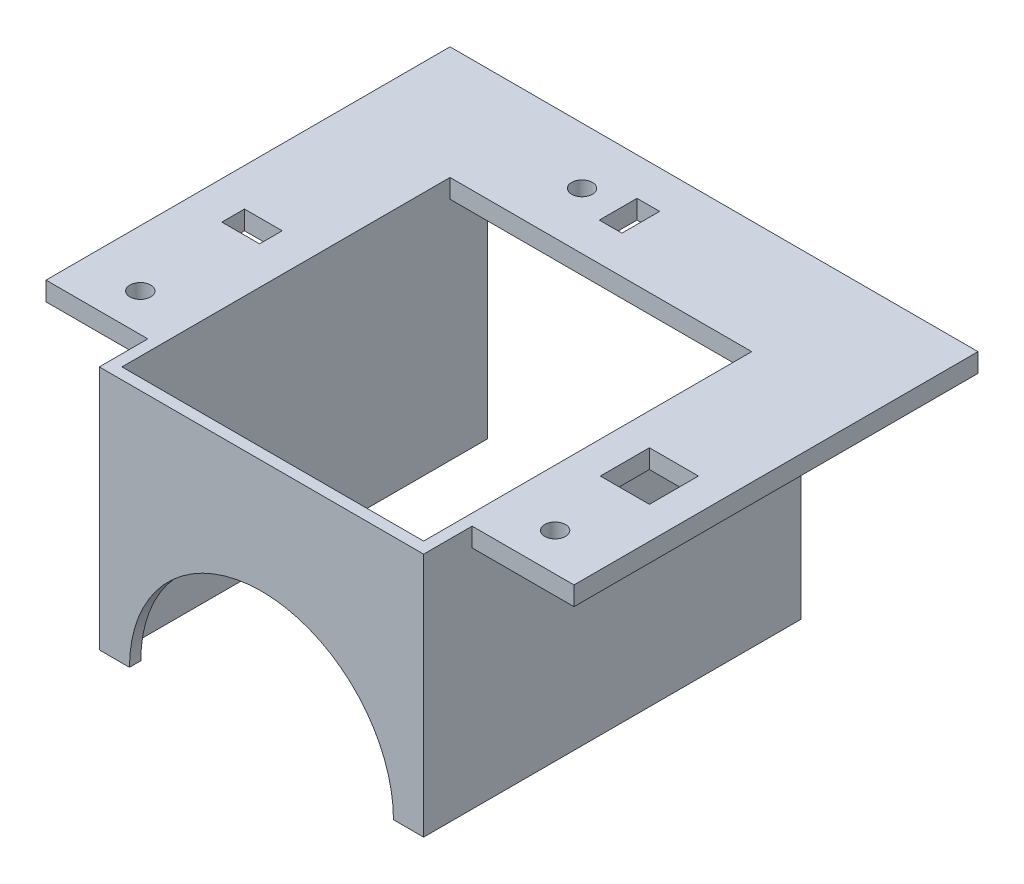
ISO-10303-21;
HEADER;
FILE_DESCRIPTION(('STEP AP214'),'2;1');
FILE_NAME('part.step','',(''),(''),'','','');
FILE_SCHEMA(('AUTOMOTIVE_DESIGN { 1 0 10303 214 1 1 1 1 }'));
ENDSEC;
DATA;
#1=APPLICATION_CONTEXT('core data for automotive mechanical design processes');
#2=APPLICATION_PROTOCOL_DEFINITION('international standard','automotive_design',2000,#1);
#3=PRODUCT_CONTEXT('',#1,'mechanical');
#4=PRODUCT('Part','Part','',(#3));
#5=PRODUCT_RELATED_PRODUCT_CATEGORY('part','',(#4));
#6=PRODUCT_DEFINITION_FORMATION('','',#4);
#7=PRODUCT_DEFINITION_CONTEXT('part definition',#1,'design');
#8=PRODUCT_DEFINITION('design','',#6,#7);
#9=PRODUCT_DEFINITION_SHAPE('','',#8);
#10=(LENGTH_UNIT() NAMED_UNIT(*) SI_UNIT(.MILLI.,.METRE.));
#11=(NAMED_UNIT(*) PLANE_ANGLE_UNIT() SI_UNIT($,.RADIAN.));
#12=(NAMED_UNIT(*) SI_UNIT($,.STERADIAN.) SOLID_ANGLE_UNIT());
#13=UNCERTAINTY_MEASURE_WITH_UNIT(LENGTH_MEASURE(1.E-05),#10,'distance_accuracy_value','');
#14=(GEOMETRIC_REPRESENTATION_CONTEXT(3) GLOBAL_UNCERTAINTY_ASSIGNED_CONTEXT((#13)) GLOBAL_UNIT_ASSIGNED_CONTEXT((#10,
#11,#12)) REPRESENTATION_CONTEXT('',''));
#15=CARTESIAN_POINT('',(0.,0.,0.));
#16=DIRECTION('',(0.,0.,1.));
#17=DIRECTION('',(1.,0.,0.));
#18=AXIS2_PLACEMENT_3D('',#15,#16,#17);
#19=CARTESIAN_POINT('',(86.,60.,0.));
#20=DIRECTION('',(0.,0.,-1.));
#21=DIRECTION('',(-1.,0.,0.));
#22=AXIS2_PLACEMENT_3D('',#19,#20,#21);
#23=PLANE('',#22);
#24=CARTESIAN_POINT('',(43.,0.,0.));
#25=DIRECTION('',(0.,0.,-1.));
#26=DIRECTION('',(-1.,0.,0.));
#27=AXIS2_PLACEMENT_3D('',#24,#25,#26);
#28=CIRCLE('',#27,35.);
#29=CARTESIAN_POINT('',(8.00000000000002,0.,0.));
#30=VERTEX_POINT('',#29);
#31=CARTESIAN_POINT('',(78.,0.,0.));
#32=VERTEX_POINT('',#31);
#33=EDGE_CURVE('E310',#30,#32,#28,.T.);
#34=ORIENTED_EDGE('',*,*,#33,.T.);
#35=DIRECTION('',(1.,0.,0.));
#36=VECTOR('',#35,1.);
#37=CARTESIAN_POINT('',(86.,0.,0.));
#38=LINE('',#37,#36);
#39=CARTESIAN_POINT('',(86.,0.,0.));
#40=VERTEX_POINT('',#39);
#41=EDGE_CURVE('E387',#32,#40,#38,.T.);
#42=ORIENTED_EDGE('',*,*,#41,.T.);
#43=DIRECTION('',(0.,-1.,0.));
#44=VECTOR('',#43,1.);
#45=CARTESIAN_POINT('',(86.,60.,0.));
#46=LINE('',#45,#44);
#47=CARTESIAN_POINT('',(86.,65.,0.));
#48=VERTEX_POINT('',#47);
#49=EDGE_CURVE('E400',#48,#40,#46,.T.);
#50=ORIENTED_EDGE('',*,*,#49,.F.);
#51=DIRECTION('',(1.,0.,0.));
#52=VECTOR('',#51,1.);
#53=CARTESIAN_POINT('',(0.,65.,0.));
#54=LINE('',#53,#52);
#55=CARTESIAN_POINT('',(0.,65.,0.));
#56=VERTEX_POINT('',#55);
#57=EDGE_CURVE('E318',#56,#48,#54,.T.);
#58=ORIENTED_EDGE('',*,*,#57,.F.);
#59=DIRECTION('',(0.,-1.,0.));
#60=VECTOR('',#59,1.);
#61=CARTESIAN_POINT('',(0.,60.,0.));
#62=LINE('',#61,#60);
#63=CARTESIAN_POINT('',(0.,0.,0.));
#64=VERTEX_POINT('',#63);
#65=EDGE_CURVE('E501',#56,#64,#62,.T.);
#66=ORIENTED_EDGE('',*,*,#65,.T.);
#67=EDGE_CURVE('E477',#64,#30,#38,.T.);
#68=ORIENTED_EDGE('',*,*,#67,.T.);
#69=EDGE_LOOP('',(#34,#42,#50,#58,#66,#68));
#70=FACE_BOUND('',#69,.T.);
#71=ADVANCED_FACE('F35',(#70),#23,.F.);
#72=CARTESIAN_POINT('',(3.00000000000001,60.,-2.99999999999999));
#73=DIRECTION('',(0.,0.,1.));
#74=DIRECTION('',(1.,0.,0.));
#75=AXIS2_PLACEMENT_3D('',#72,#73,#74);
#76=PLANE('',#75);
#77=CARTESIAN_POINT('',(43.,0.,-2.99999999999999));
#78=DIRECTION('',(0.,0.,1.));
#79=DIRECTION('',(1.,0.,0.));
#80=AXIS2_PLACEMENT_3D('',#77,#78,#79);
#81=CIRCLE('',#80,35.);
#82=CARTESIAN_POINT('',(8.00000000000001,0.,-2.99999999999999));
#83=VERTEX_POINT('',#82);
#84=CARTESIAN_POINT('',(78.,0.,-2.99999999999999));
#85=VERTEX_POINT('',#84);
#86=EDGE_CURVE('E313',#83,#85,#81,.F.);
#87=ORIENTED_EDGE('',*,*,#86,.F.);
#88=DIRECTION('',(-1.,0.,0.));
#89=VECTOR('',#88,1.);
#90=CARTESIAN_POINT('',(3.00000000000001,0.,-2.99999999999999));
#91=LINE('',#90,#89);
#92=CARTESIAN_POINT('',(3.00000000000001,0.,-2.99999999999999));
#93=VERTEX_POINT('',#92);
#94=EDGE_CURVE('E493',#83,#93,#91,.T.);
#95=ORIENTED_EDGE('',*,*,#94,.T.);
#96=DIRECTION('',(0.,-1.,0.));
#97=VECTOR('',#96,1.);
#98=CARTESIAN_POINT('',(3.00000000000001,60.,-2.99999999999999));
#99=LINE('',#98,#97);
#100=CARTESIAN_POINT('',(3.00000000000002,65.,-2.99999999999999));
#101=VERTEX_POINT('',#100);
#102=EDGE_CURVE('E509',#101,#93,#99,.T.);
#103=ORIENTED_EDGE('',*,*,#102,.F.);
#104=DIRECTION('',(-1.,0.,0.));
#105=VECTOR('',#104,1.);
#106=CARTESIAN_POINT('',(83.,65.,-3.));
#107=LINE('',#106,#105);
#108=CARTESIAN_POINT('',(83.,65.,-3.));
#109=VERTEX_POINT('',#108);
#110=EDGE_CURVE('E323',#109,#101,#107,.T.);
#111=ORIENTED_EDGE('',*,*,#110,.F.);
#112=DIRECTION('',(0.,-1.,0.));
#113=VECTOR('',#112,1.);
#114=CARTESIAN_POINT('',(83.,60.,-3.));
#115=LINE('',#114,#113);
#116=CARTESIAN_POINT('',(83.,0.,-3.));
#117=VERTEX_POINT('',#116);
#118=EDGE_CURVE('E406',#109,#117,#115,.T.);
#119=ORIENTED_EDGE('',*,*,#118,.T.);
#120=EDGE_CURVE('E494',#117,#85,#91,.T.);
#121=ORIENTED_EDGE('',*,*,#120,.T.);
#122=EDGE_LOOP('',(#87,#95,#103,#111,#119,#121));
#123=FACE_BOUND('',#122,.T.);
#124=ADVANCED_FACE('F464',(#123),#76,.F.);
#125=CARTESIAN_POINT('',(0.,0.,0.));
#126=DIRECTION('',(0.,-1.,0.));
#127=DIRECTION('',(0.,0.,-1.));
#128=AXIS2_PLACEMENT_3D('',#125,#126,#127);
#129=PLANE('',#128);
#130=ORIENTED_EDGE('',*,*,#41,.F.);
#131=DIRECTION('',(0.,0.,1.));
#132=VECTOR('',#131,1.);
#133=CARTESIAN_POINT('',(78.,0.,-5.));
#134=LINE('',#133,#132);
#135=EDGE_CURVE('E412',#32,#85,#134,.F.);
#136=ORIENTED_EDGE('',*,*,#135,.T.);
#137=ORIENTED_EDGE('',*,*,#120,.F.);
#138=DIRECTION('',(0.,0.,1.));
#139=VECTOR('',#138,1.);
#140=CARTESIAN_POINT('',(83.,0.,-3.));
#141=LINE('',#140,#139);
#142=CARTESIAN_POINT('',(83.,0.,-100.));
#143=VERTEX_POINT('',#142);
#144=EDGE_CURVE('E491',#143,#117,#141,.T.);
#145=ORIENTED_EDGE('',*,*,#144,.F.);
#146=DIRECTION('',(-1.,0.,0.));
#147=VECTOR('',#146,1.);
#148=CARTESIAN_POINT('',(83.,0.,-100.));
#149=LINE('',#148,#147);
#150=CARTESIAN_POINT('',(86.,0.,-100.));
#151=VERTEX_POINT('',#150);
#152=EDGE_CURVE('E489',#151,#143,#149,.T.);
#153=ORIENTED_EDGE('',*,*,#152,.F.);
#154=DIRECTION('',(0.,0.,-1.));
#155=VECTOR('',#154,1.);
#156=CARTESIAN_POINT('',(86.,0.,-100.));
#157=LINE('',#156,#155);
#158=EDGE_CURVE('E483',#40,#151,#157,.T.);
#159=ORIENTED_EDGE('',*,*,#158,.F.);
#160=EDGE_LOOP('',(#130,#136,#137,#145,#153,#159));
#161=FACE_BOUND('',#160,.T.);
#162=ADVANCED_FACE('F469',(#161),#129,.T.);
#163=ORIENTED_EDGE('',*,*,#94,.F.);
#164=DIRECTION('',(0.,0.,1.));
#165=VECTOR('',#164,1.);
#166=CARTESIAN_POINT('',(8.00000000000001,0.,-5.));
#167=LINE('',#166,#165);
#168=EDGE_CURVE('E409',#83,#30,#167,.T.);
#169=ORIENTED_EDGE('',*,*,#168,.T.);
#170=ORIENTED_EDGE('',*,*,#67,.F.);
#171=DIRECTION('',(0.,0.,1.));
#172=VECTOR('',#171,1.);
#173=CARTESIAN_POINT('',(0.,0.,0.));
#174=LINE('',#173,#172);
#175=CARTESIAN_POINT('',(0.,0.,-100.));
#176=VERTEX_POINT('',#175);
#177=EDGE_CURVE('E392',#176,#64,#174,.T.);
#178=ORIENTED_EDGE('',*,*,#177,.F.);
#179=DIRECTION('',(-1.,0.,0.));
#180=VECTOR('',#179,1.);
#181=CARTESIAN_POINT('',(0.,0.,-100.));
#182=LINE('',#181,#180);
#183=CARTESIAN_POINT('',(3.,0.,-100.));
#184=VERTEX_POINT('',#183);
#185=EDGE_CURVE('E498',#184,#176,#182,.T.);
#186=ORIENTED_EDGE('',*,*,#185,.F.);
#187=DIRECTION('',(0.,0.,-1.));
#188=VECTOR('',#187,1.);
#189=CARTESIAN_POINT('',(3.,0.,-100.));
#190=LINE('',#189,#188);
#191=EDGE_CURVE('E496',#93,#184,#190,.T.);
#192=ORIENTED_EDGE('',*,*,#191,.F.);
#193=EDGE_LOOP('',(#163,#169,#170,#178,#186,#192));
#194=FACE_BOUND('',#193,.T.);
#195=ADVANCED_FACE('F544',(#194),#129,.T.);
#196=CARTESIAN_POINT('',(83.,65.,-12.865007186349));
#197=DIRECTION('',(0.,0.,-1.));
#198=DIRECTION('',(-1.,0.,0.));
#199=AXIS2_PLACEMENT_3D('',#196,#197,#198);
#200=PLANE('',#199);
#201=DIRECTION('',(0.,-1.,0.));
#202=VECTOR('',#201,1.);
#203=CARTESIAN_POINT('',(86.,65.,-12.865007186349));
#204=LINE('',#203,#202);
#205=CARTESIAN_POINT('',(86.,65.,-12.865007186349));
#206=VERTEX_POINT('',#205);
#207=CARTESIAN_POINT('',(86.,60.,-12.865007186349));
#208=VERTEX_POINT('',#207);
#209=EDGE_CURVE('E326',#206,#208,#204,.T.);
#210=ORIENTED_EDGE('',*,*,#209,.T.);
#211=DIRECTION('',(1.,0.,0.));
#212=VECTOR('',#211,1.);
#213=CARTESIAN_POINT('',(83.,60.,-12.865007186349));
#214=LINE('',#213,#212);
#215=CARTESIAN_POINT('',(113.,60.,-12.865007186349));
#216=VERTEX_POINT('',#215);
#217=EDGE_CURVE('E366',#208,#216,#214,.T.);
#218=ORIENTED_EDGE('',*,*,#217,.T.);
#219=DIRECTION('',(0.,-1.,0.));
#220=VECTOR('',#219,1.);
#221=CARTESIAN_POINT('',(113.,65.,-12.865007186349));
#222=LINE('',#221,#220);
#223=CARTESIAN_POINT('',(113.,65.,-12.865007186349));
#224=VERTEX_POINT('',#223);
#225=EDGE_CURVE('E384',#224,#216,#222,.T.);
#226=ORIENTED_EDGE('',*,*,#225,.F.);
#227=DIRECTION('',(1.,0.,0.));
#228=VECTOR('',#227,1.);
#229=CARTESIAN_POINT('',(83.,65.,-12.865007186349));
#230=LINE('',#229,#228);
#231=EDGE_CURVE('E370',#206,#224,#230,.T.);
#232=ORIENTED_EDGE('',*,*,#231,.F.);
#233=EDGE_LOOP('',(#210,#218,#226,#232));
#234=FACE_BOUND('',#233,.T.);
#235=ADVANCED_FACE('F560',(#234),#200,.F.);
#236=CARTESIAN_POINT('',(3.,65.,-12.865007186349));
#237=DIRECTION('',(0.,0.,-1.));
#238=DIRECTION('',(-1.,0.,0.));
#239=AXIS2_PLACEMENT_3D('',#236,#237,#238);
#240=PLANE('',#239);
#241=DIRECTION('',(0.,-1.,0.));
#242=VECTOR('',#241,1.);
#243=CARTESIAN_POINT('',(0.,65.,-12.865007186349));
#244=LINE('',#243,#242);
#245=CARTESIAN_POINT('',(0.,65.,-12.865007186349));
#246=VERTEX_POINT('',#245);
#247=CARTESIAN_POINT('',(0.,60.,-12.865007186349));
#248=VERTEX_POINT('',#247);
#249=EDGE_CURVE('E328',#246,#248,#244,.T.);
#250=ORIENTED_EDGE('',*,*,#249,.F.);
#251=DIRECTION('',(1.,0.,0.));
#252=VECTOR('',#251,1.);
#253=CARTESIAN_POINT('',(3.,65.,-12.865007186349));
#254=LINE('',#253,#252);
#255=CARTESIAN_POINT('',(-27.,65.,-12.865007186349));
#256=VERTEX_POINT('',#255);
#257=EDGE_CURVE('E352',#256,#246,#254,.T.);
#258=ORIENTED_EDGE('',*,*,#257,.F.);
#259=DIRECTION('',(0.,-1.,0.));
#260=VECTOR('',#259,1.);
#261=CARTESIAN_POINT('',(-27.,65.,-12.865007186349));
#262=LINE('',#261,#260);
#263=CARTESIAN_POINT('',(-27.,60.,-12.865007186349));
#264=VERTEX_POINT('',#263);
#265=EDGE_CURVE('E355',#256,#264,#262,.T.);
#266=ORIENTED_EDGE('',*,*,#265,.T.);
#267=DIRECTION('',(1.,0.,0.));
#268=VECTOR('',#267,1.);
#269=CARTESIAN_POINT('',(3.,60.,-12.865007186349));
#270=LINE('',#269,#268);
#271=EDGE_CURVE('E350',#264,#248,#270,.T.);
#272=ORIENTED_EDGE('',*,*,#271,.T.);
#273=EDGE_LOOP('',(#250,#258,#266,#272));
#274=FACE_BOUND('',#273,.T.);
#275=ADVANCED_FACE('F530',(#274),#240,.F.);
#276=CARTESIAN_POINT('',(86.,60.,-100.));
#277=DIRECTION('',(-1.,0.,0.));
#278=DIRECTION('',(0.,0.,1.));
#279=AXIS2_PLACEMENT_3D('',#276,#277,#278);
#280=PLANE('',#279);
#281=ORIENTED_EDGE('',*,*,#158,.T.);
#282=DIRECTION('',(0.,-1.,0.));
#283=VECTOR('',#282,1.);
#284=CARTESIAN_POINT('',(86.,60.,-100.));
#285=LINE('',#284,#283);
#286=CARTESIAN_POINT('',(86.,60.,-100.));
#287=VERTEX_POINT('',#286);
#288=EDGE_CURVE('E405',#287,#151,#285,.T.);
#289=ORIENTED_EDGE('',*,*,#288,.F.);
#290=DIRECTION('',(0.,0.,-1.));
#291=VECTOR('',#290,1.);
#292=CARTESIAN_POINT('',(86.,60.,-100.));
#293=LINE('',#292,#291);
#294=EDGE_CURVE('E388',#208,#287,#293,.T.);
#295=ORIENTED_EDGE('',*,*,#294,.F.);
#296=ORIENTED_EDGE('',*,*,#209,.F.);
#297=DIRECTION('',(0.,0.,-1.));
#298=VECTOR('',#297,1.);
#299=CARTESIAN_POINT('',(86.,65.,0.));
#300=LINE('',#299,#298);
#301=EDGE_CURVE('E321',#48,#206,#300,.T.);
#302=ORIENTED_EDGE('',*,*,#301,.F.);
#303=ORIENTED_EDGE('',*,*,#49,.T.);
#304=EDGE_LOOP('',(#281,#289,#295,#296,#302,#303));
#305=FACE_BOUND('',#304,.T.);
#306=ADVANCED_FACE('F518',(#305),#280,.F.);
#307=CARTESIAN_POINT('',(83.,60.,-100.));
#308=DIRECTION('',(0.,0.,1.));
#309=DIRECTION('',(1.,0.,0.));
#310=AXIS2_PLACEMENT_3D('',#307,#308,#309);
#311=PLANE('',#310);
#312=ORIENTED_EDGE('',*,*,#152,.T.);
#313=DIRECTION('',(0.,-1.,0.));
#314=VECTOR('',#313,1.);
#315=CARTESIAN_POINT('',(83.,60.,-100.));
#316=LINE('',#315,#314);
#317=CARTESIAN_POINT('',(83.,60.,-100.));
#318=VERTEX_POINT('',#317);
#319=EDGE_CURVE('E402',#318,#143,#316,.T.);
#320=ORIENTED_EDGE('',*,*,#319,.F.);
#321=DIRECTION('',(-1.,0.,0.));
#322=VECTOR('',#321,1.);
#323=CARTESIAN_POINT('',(83.,60.,-100.));
#324=LINE('',#323,#322);
#325=EDGE_CURVE('E391',#287,#318,#324,.T.);
#326=ORIENTED_EDGE('',*,*,#325,.F.);
#327=ORIENTED_EDGE('',*,*,#288,.T.);
#328=EDGE_LOOP('',(#312,#320,#326,#327));
#329=FACE_BOUND('',#328,.T.);
#330=ADVANCED_FACE('F554',(#329),#311,.F.);
#331=CARTESIAN_POINT('',(83.,60.,-3.));
#332=DIRECTION('',(1.,0.,0.));
#333=DIRECTION('',(0.,0.,-1.));
#334=AXIS2_PLACEMENT_3D('',#331,#332,#333);
#335=PLANE('',#334);
#336=ORIENTED_EDGE('',*,*,#118,.F.);
#337=DIRECTION('',(0.,0.,1.));
#338=VECTOR('',#337,1.);
#339=CARTESIAN_POINT('',(83.,65.,-12.865007186349));
#340=LINE('',#339,#338);
#341=CARTESIAN_POINT('',(83.,65.,-89.999999996349));
#342=VERTEX_POINT('',#341);
#343=EDGE_CURVE('E367',#342,#109,#340,.T.);
#344=ORIENTED_EDGE('',*,*,#343,.F.);
#345=DIRECTION('',(0.,1.,0.));
#346=VECTOR('',#345,1.);
#347=CARTESIAN_POINT('',(83.,60.,-89.999999996349));
#348=LINE('',#347,#346);
#349=CARTESIAN_POINT('',(83.,60.,-89.999999996349));
#350=VERTEX_POINT('',#349);
#351=EDGE_CURVE('E358',#350,#342,#348,.T.);
#352=ORIENTED_EDGE('',*,*,#351,.F.);
#353=DIRECTION('',(0.,0.,-1.));
#354=VECTOR('',#353,1.);
#355=CARTESIAN_POINT('',(83.,60.,-119.999999996349));
#356=LINE('',#355,#354);
#357=EDGE_CURVE('E337',#350,#318,#356,.T.);
#358=ORIENTED_EDGE('',*,*,#357,.T.);
#359=ORIENTED_EDGE('',*,*,#319,.T.);
#360=ORIENTED_EDGE('',*,*,#144,.T.);
#361=EDGE_LOOP('',(#336,#344,#352,#358,#359,#360));
#362=FACE_BOUND('',#361,.T.);
#363=ADVANCED_FACE('F551',(#362),#335,.F.);
#364=CARTESIAN_POINT('',(3.,60.,-100.));
#365=DIRECTION('',(-1.,0.,0.));
#366=DIRECTION('',(0.,0.,1.));
#367=AXIS2_PLACEMENT_3D('',#364,#365,#366);
#368=PLANE('',#367);
#369=DIRECTION('',(0.,0.,1.));
#370=VECTOR('',#369,1.);
#371=CARTESIAN_POINT('',(3.,60.,-119.999999996349));
#372=LINE('',#371,#370);
#373=CARTESIAN_POINT('',(3.,60.,-100.));
#374=VERTEX_POINT('',#373);
#375=CARTESIAN_POINT('',(3.00000000000001,60.,-89.999999996349));
#376=VERTEX_POINT('',#375);
#377=EDGE_CURVE('E331',#374,#376,#372,.T.);
#378=ORIENTED_EDGE('',*,*,#377,.T.);
#379=DIRECTION('',(0.,1.,0.));
#380=VECTOR('',#379,1.);
#381=CARTESIAN_POINT('',(3.00000000000001,60.,-89.999999996349));
#382=LINE('',#381,#380);
#383=CARTESIAN_POINT('',(3.00000000000001,65.,-89.999999996349));
#384=VERTEX_POINT('',#383);
#385=EDGE_CURVE('E345',#376,#384,#382,.T.);
#386=ORIENTED_EDGE('',*,*,#385,.T.);
#387=DIRECTION('',(0.,0.,-1.));
#388=VECTOR('',#387,1.);
#389=CARTESIAN_POINT('',(3.,65.,-119.999999996349));
#390=LINE('',#389,#388);
#391=EDGE_CURVE('E346',#101,#384,#390,.T.);
#392=ORIENTED_EDGE('',*,*,#391,.F.);
#393=ORIENTED_EDGE('',*,*,#102,.T.);
#394=ORIENTED_EDGE('',*,*,#191,.T.);
#395=DIRECTION('',(0.,-1.,0.));
#396=VECTOR('',#395,1.);
#397=CARTESIAN_POINT('',(3.,60.,-100.));
#398=LINE('',#397,#396);
#399=EDGE_CURVE('E506',#374,#184,#398,.T.);
#400=ORIENTED_EDGE('',*,*,#399,.F.);
#401=EDGE_LOOP('',(#378,#386,#392,#393,#394,#400));
#402=FACE_BOUND('',#401,.T.);
#403=ADVANCED_FACE('F600',(#402),#368,.F.);
#404=CARTESIAN_POINT('',(0.,60.,-100.));
#405=DIRECTION('',(0.,0.,1.));
#406=DIRECTION('',(1.,0.,0.));
#407=AXIS2_PLACEMENT_3D('',#404,#405,#406);
#408=PLANE('',#407);
#409=ORIENTED_EDGE('',*,*,#185,.T.);
#410=DIRECTION('',(0.,-1.,0.));
#411=VECTOR('',#410,1.);
#412=CARTESIAN_POINT('',(0.,60.,-100.));
#413=LINE('',#412,#411);
#414=CARTESIAN_POINT('',(0.,60.,-100.));
#415=VERTEX_POINT('',#414);
#416=EDGE_CURVE('E503',#415,#176,#413,.T.);
#417=ORIENTED_EDGE('',*,*,#416,.F.);
#418=DIRECTION('',(-1.,0.,0.));
#419=VECTOR('',#418,1.);
#420=CARTESIAN_POINT('',(0.,60.,-100.));
#421=LINE('',#420,#419);
#422=EDGE_CURVE('E395',#374,#415,#421,.T.);
#423=ORIENTED_EDGE('',*,*,#422,.F.);
#424=ORIENTED_EDGE('',*,*,#399,.T.);
#425=EDGE_LOOP('',(#409,#417,#423,#424));
#426=FACE_BOUND('',#425,.T.);
#427=ADVANCED_FACE('F597',(#426),#408,.F.);
#428=CARTESIAN_POINT('',(0.,60.,0.));
#429=DIRECTION('',(1.,0.,0.));
#430=DIRECTION('',(0.,0.,-1.));
#431=AXIS2_PLACEMENT_3D('',#428,#429,#430);
#432=PLANE('',#431);
#433=ORIENTED_EDGE('',*,*,#177,.T.);
#434=ORIENTED_EDGE('',*,*,#65,.F.);
#435=DIRECTION('',(0.,0.,1.));
#436=VECTOR('',#435,1.);
#437=CARTESIAN_POINT('',(0.,65.,-12.865007186349));
#438=LINE('',#437,#436);
#439=EDGE_CURVE('E315',#246,#56,#438,.T.);
#440=ORIENTED_EDGE('',*,*,#439,.F.);
#441=ORIENTED_EDGE('',*,*,#249,.T.);
#442=DIRECTION('',(0.,0.,1.));
#443=VECTOR('',#442,1.);
#444=CARTESIAN_POINT('',(0.,60.,0.));
#445=LINE('',#444,#443);
#446=EDGE_CURVE('E487',#415,#248,#445,.T.);
#447=ORIENTED_EDGE('',*,*,#446,.F.);
#448=ORIENTED_EDGE('',*,*,#416,.T.);
#449=EDGE_LOOP('',(#433,#434,#440,#441,#447,#448));
#450=FACE_BOUND('',#449,.T.);
#451=ADVANCED_FACE('F526',(#450),#432,.F.);
#452=CARTESIAN_POINT('',(113.,65.,-12.865007186349));
#453=DIRECTION('',(-1.,0.,0.));
#454=DIRECTION('',(0.,0.,1.));
#455=AXIS2_PLACEMENT_3D('',#452,#453,#454);
#456=PLANE('',#455);
#457=DIRECTION('',(0.,0.,-1.));
#458=VECTOR('',#457,1.);
#459=CARTESIAN_POINT('',(113.,60.,-12.865007186349));
#460=LINE('',#459,#458);
#461=CARTESIAN_POINT('',(113.,60.,-119.999999996349));
#462=VERTEX_POINT('',#461);
#463=EDGE_CURVE('E379',#216,#462,#460,.T.);
#464=ORIENTED_EDGE('',*,*,#463,.T.);
#465=DIRECTION('',(0.,-1.,0.));
#466=VECTOR('',#465,1.);
#467=CARTESIAN_POINT('',(113.,65.,-119.999999996349));
#468=LINE('',#467,#466);
#469=CARTESIAN_POINT('',(113.,65.,-119.999999996349));
#470=VERTEX_POINT('',#469);
#471=EDGE_CURVE('E377',#470,#462,#468,.T.);
#472=ORIENTED_EDGE('',*,*,#471,.F.);
#473=DIRECTION('',(0.,0.,-1.));
#474=VECTOR('',#473,1.);
#475=CARTESIAN_POINT('',(113.,65.,-12.865007186349));
#476=LINE('',#475,#474);
#477=EDGE_CURVE('E373',#224,#470,#476,.T.);
#478=ORIENTED_EDGE('',*,*,#477,.F.);
#479=ORIENTED_EDGE('',*,*,#225,.T.);
#480=EDGE_LOOP('',(#464,#472,#478,#479));
#481=FACE_BOUND('',#480,.T.);
#482=ADVANCED_FACE('F566',(#481),#456,.F.);
#483=CARTESIAN_POINT('',(83.,65.,-119.999999996349));
#484=DIRECTION('',(0.,0.,1.));
#485=DIRECTION('',(1.,0.,0.));
#486=AXIS2_PLACEMENT_3D('',#483,#484,#485);
#487=PLANE('',#486);
#488=DIRECTION('',(-1.,0.,0.));
#489=VECTOR('',#488,1.);
#490=CARTESIAN_POINT('',(83.,60.,-119.999999996349));
#491=LINE('',#490,#489);
#492=CARTESIAN_POINT('',(-27.,60.,-119.999999996349));
#493=VERTEX_POINT('',#492);
#494=EDGE_CURVE('E371',#462,#493,#491,.T.);
#495=ORIENTED_EDGE('',*,*,#494,.T.);
#496=DIRECTION('',(0.,-1.,0.));
#497=VECTOR('',#496,1.);
#498=CARTESIAN_POINT('',(-27.,65.,-119.999999996349));
#499=LINE('',#498,#497);
#500=CARTESIAN_POINT('',(-27.,65.,-119.999999996349));
#501=VERTEX_POINT('',#500);
#502=EDGE_CURVE('E363',#501,#493,#499,.T.);
#503=ORIENTED_EDGE('',*,*,#502,.F.);
#504=DIRECTION('',(-1.,0.,0.));
#505=VECTOR('',#504,1.);
#506=CARTESIAN_POINT('',(83.,65.,-119.999999996349));
#507=LINE('',#506,#505);
#508=EDGE_CURVE('E375',#470,#501,#507,.T.);
#509=ORIENTED_EDGE('',*,*,#508,.F.);
#510=ORIENTED_EDGE('',*,*,#471,.T.);
#511=EDGE_LOOP('',(#495,#503,#509,#510));
#512=FACE_BOUND('',#511,.T.);
#513=ADVANCED_FACE('F568',(#512),#487,.F.);
#514=CARTESIAN_POINT('',(0.,65.,0.));
#515=DIRECTION('',(0.,-1.,0.));
#516=DIRECTION('',(0.,0.,-1.));
#517=AXIS2_PLACEMENT_3D('',#514,#515,#516);
#518=PLANE('',#517);
#519=DIRECTION('',(-1.,0.,0.));
#520=VECTOR('',#519,1.);
#521=CARTESIAN_POINT('',(91.5,65.,-54.365007186349));
#522=LINE('',#521,#520);
#523=CARTESIAN_POINT('',(104.5,65.,-54.365007186349));
#524=VERTEX_POINT('',#523);
#525=CARTESIAN_POINT('',(91.5,65.,-54.365007186349));
#526=VERTEX_POINT('',#525);
#527=EDGE_CURVE('E242',#524,#526,#522,.T.);
#528=ORIENTED_EDGE('',*,*,#527,.F.);
#529=DIRECTION('',(0.,0.,-1.));
#530=VECTOR('',#529,1.);
#531=CARTESIAN_POINT('',(104.5,65.,-41.365007186349));
#532=LINE('',#531,#530);
#533=CARTESIAN_POINT('',(104.5,65.,-41.365007186349));
#534=VERTEX_POINT('',#533);
#535=EDGE_CURVE('E49',#534,#524,#532,.T.);
#536=ORIENTED_EDGE('',*,*,#535,.F.);
#537=DIRECTION('',(1.,0.,0.));
#538=VECTOR('',#537,1.);
#539=CARTESIAN_POINT('',(91.5,65.,-41.365007186349));
#540=LINE('',#539,#538);
#541=CARTESIAN_POINT('',(91.5,65.,-41.365007186349));
#542=VERTEX_POINT('',#541);
#543=EDGE_CURVE('E249',#542,#534,#540,.T.);
#544=ORIENTED_EDGE('',*,*,#543,.F.);
#545=DIRECTION('',(0.,0.,1.));
#546=VECTOR('',#545,1.);
#547=CARTESIAN_POINT('',(91.5,65.,-41.365007186349));
#548=LINE('',#547,#546);
#549=EDGE_CURVE('E233',#526,#542,#548,.T.);
#550=ORIENTED_EDGE('',*,*,#549,.F.);
#551=EDGE_LOOP('',(#528,#536,#544,#550));
#552=FACE_BOUND('',#551,.T.);
#553=DIRECTION('',(1.,0.,0.));
#554=VECTOR('',#553,1.);
#555=CARTESIAN_POINT('',(32.581142125382,65.,-99.9999999963489));
#556=LINE('',#555,#554);
#557=CARTESIAN_POINT('',(32.581142125382,65.,-99.9999999963489));
#558=VERTEX_POINT('',#557);
#559=CARTESIAN_POINT('',(38.581142125382,65.,-99.9999999963489));
#560=VERTEX_POINT('',#559);
#561=EDGE_CURVE('E260',#558,#560,#556,.T.);
#562=ORIENTED_EDGE('',*,*,#561,.F.);
#563=DIRECTION('',(0.,0.,1.));
#564=VECTOR('',#563,1.);
#565=CARTESIAN_POINT('',(32.581142125382,65.,-99.9999999963489));
#566=LINE('',#565,#564);
#567=CARTESIAN_POINT('',(32.581142125382,65.,-109.999999996349));
#568=VERTEX_POINT('',#567);
#569=EDGE_CURVE('E256',#568,#558,#566,.T.);
#570=ORIENTED_EDGE('',*,*,#569,.F.);
#571=DIRECTION('',(-1.,0.,0.));
#572=VECTOR('',#571,1.);
#573=CARTESIAN_POINT('',(32.581142125382,65.,-109.999999996349));
#574=LINE('',#573,#572);
#575=CARTESIAN_POINT('',(38.581142125382,65.,-109.999999996349));
#576=VERTEX_POINT('',#575);
#577=EDGE_CURVE('E266',#576,#568,#574,.T.);
#578=ORIENTED_EDGE('',*,*,#577,.F.);
#579=DIRECTION('',(0.,0.,-1.));
#580=VECTOR('',#579,1.);
#581=CARTESIAN_POINT('',(38.581142125382,65.,-99.9999999963489));
#582=LINE('',#581,#580);
#583=EDGE_CURVE('E263',#560,#576,#582,.T.);
#584=ORIENTED_EDGE('',*,*,#583,.F.);
#585=EDGE_LOOP('',(#562,#570,#578,#584));
#586=FACE_BOUND('',#585,.T.);
#587=DIRECTION('',(1.,0.,0.));
#588=VECTOR('',#587,1.);
#589=CARTESIAN_POINT('',(-17.,65.,-49.499999996349));
#590=LINE('',#589,#588);
#591=CARTESIAN_POINT('',(-17.,65.,-49.499999996349));
#592=VERTEX_POINT('',#591);
#593=CARTESIAN_POINT('',(-6.99999999999998,65.,-49.499999996349));
#594=VERTEX_POINT('',#593);
#595=EDGE_CURVE('E280',#592,#594,#590,.T.);
#596=ORIENTED_EDGE('',*,*,#595,.F.);
#597=DIRECTION('',(0.,0.,1.));
#598=VECTOR('',#597,1.);
#599=CARTESIAN_POINT('',(-17.,65.,-49.499999996349));
#600=LINE('',#599,#598);
#601=CARTESIAN_POINT('',(-17.,65.,-55.499999996349));
#602=VERTEX_POINT('',#601);
#603=EDGE_CURVE('E272',#602,#592,#600,.T.);
#604=ORIENTED_EDGE('',*,*,#603,.F.);
#605=DIRECTION('',(-1.,0.,0.));
#606=VECTOR('',#605,1.);
#607=CARTESIAN_POINT('',(-17.,65.,-55.499999996349));
#608=LINE('',#607,#606);
#609=CARTESIAN_POINT('',(-6.99999999999999,65.,-55.499999996349));
#610=VERTEX_POINT('',#609);
#611=EDGE_CURVE('E286',#610,#602,#608,.T.);
#612=ORIENTED_EDGE('',*,*,#611,.F.);
#613=DIRECTION('',(0.,0.,-1.));
#614=VECTOR('',#613,1.);
#615=CARTESIAN_POINT('',(-6.99999999999998,65.,-49.499999996349));
#616=LINE('',#615,#614);
#617=EDGE_CURVE('E283',#594,#610,#616,.T.);
#618=ORIENTED_EDGE('',*,*,#617,.F.);
#619=EDGE_LOOP('',(#596,#604,#612,#618));
#620=FACE_BOUND('',#619,.T.);
#621=CARTESIAN_POINT('',(98.,65.,-22.865007186349));
#622=DIRECTION('',(0.,1.,0.));
#623=DIRECTION('',(0.,0.,1.));
#624=AXIS2_PLACEMENT_3D('',#621,#622,#623);
#625=CIRCLE('',#624,2.75000000000001);
#626=CARTESIAN_POINT('',(98.,65.,-20.115007186349));
#627=VERTEX_POINT('',#626);
#628=EDGE_CURVE('E292',#627,#627,#625,.T.);
#629=ORIENTED_EDGE('',*,*,#628,.F.);
#630=EDGE_LOOP('',(#629));
#631=FACE_BOUND('',#630,.T.);
#632=CARTESIAN_POINT('',(23.,65.,-104.999999996349));
#633=DIRECTION('',(0.,1.,0.));
#634=DIRECTION('',(0.,0.,1.));
#635=AXIS2_PLACEMENT_3D('',#632,#633,#634);
#636=CIRCLE('',#635,2.75000000000001);
#637=CARTESIAN_POINT('',(23.,65.,-102.249999996349));
#638=VERTEX_POINT('',#637);
#639=EDGE_CURVE('E302',#638,#638,#636,.T.);
#640=ORIENTED_EDGE('',*,*,#639,.F.);
#641=EDGE_LOOP('',(#640));
#642=FACE_BOUND('',#641,.T.);
#643=CARTESIAN_POINT('',(-12.,65.,-22.865007186349));
#644=DIRECTION('',(0.,1.,0.));
#645=DIRECTION('',(0.,0.,1.));
#646=AXIS2_PLACEMENT_3D('',#643,#644,#645);
#647=CIRCLE('',#646,2.75);
#648=CARTESIAN_POINT('',(-12.,65.,-20.115007186349));
#649=VERTEX_POINT('',#648);
#650=EDGE_CURVE('E306',#649,#649,#647,.T.);
#651=ORIENTED_EDGE('',*,*,#650,.F.);
#652=EDGE_LOOP('',(#651));
#653=FACE_BOUND('',#652,.T.);
#654=ORIENTED_EDGE('',*,*,#301,.T.);
#655=ORIENTED_EDGE('',*,*,#231,.T.);
#656=ORIENTED_EDGE('',*,*,#477,.T.);
#657=ORIENTED_EDGE('',*,*,#508,.T.);
#658=DIRECTION('',(0.,0.,1.));
#659=VECTOR('',#658,1.);
#660=CARTESIAN_POINT('',(-27.,65.,-119.999999996349));
#661=LINE('',#660,#659);
#662=EDGE_CURVE('E349',#501,#256,#661,.T.);
#663=ORIENTED_EDGE('',*,*,#662,.T.);
#664=ORIENTED_EDGE('',*,*,#257,.T.);
#665=ORIENTED_EDGE('',*,*,#439,.T.);
#666=ORIENTED_EDGE('',*,*,#57,.T.);
#667=EDGE_LOOP('',(#654,#655,#656,#657,#663,#664,#665,#666));
#668=FACE_BOUND('',#667,.T.);
#669=ORIENTED_EDGE('',*,*,#343,.T.);
#670=ORIENTED_EDGE('',*,*,#110,.T.);
#671=ORIENTED_EDGE('',*,*,#391,.T.);
#672=DIRECTION('',(1.,0.,0.));
#673=VECTOR('',#672,1.);
#674=CARTESIAN_POINT('',(3.00000000000001,65.,-89.999999996349));
#675=LINE('',#674,#673);
#676=EDGE_CURVE('E330',#384,#342,#675,.T.);
#677=ORIENTED_EDGE('',*,*,#676,.T.);
#678=EDGE_LOOP('',(#669,#670,#671,#677));
#679=FACE_BOUND('',#678,.T.);
#680=ADVANCED_FACE('F246',(#552,#586,#620,#631,#642,#653,#668,#679),#518,.F.);
#681=CARTESIAN_POINT('',(0.,60.,0.));
#682=DIRECTION('',(0.,-1.,0.));
#683=DIRECTION('',(0.,0.,-1.));
#684=AXIS2_PLACEMENT_3D('',#681,#682,#683);
#685=PLANE('',#684);
#686=DIRECTION('',(0.,0.,1.));
#687=VECTOR('',#686,1.);
#688=CARTESIAN_POINT('',(104.5,60.,0.));
#689=LINE('',#688,#687);
#690=CARTESIAN_POINT('',(104.5,60.,-54.365007186349));
#691=VERTEX_POINT('',#690);
#692=CARTESIAN_POINT('',(104.5,60.,-41.365007186349));
#693=VERTEX_POINT('',#692);
#694=EDGE_CURVE('E11',#691,#693,#689,.T.);
#695=ORIENTED_EDGE('',*,*,#694,.F.);
#696=DIRECTION('',(1.,0.,0.));
#697=VECTOR('',#696,1.);
#698=CARTESIAN_POINT('',(0.,60.,-54.365007186349));
#699=LINE('',#698,#697);
#700=CARTESIAN_POINT('',(91.5,60.,-54.365007186349));
#701=VERTEX_POINT('',#700);
#702=EDGE_CURVE('E439',#701,#691,#699,.T.);
#703=ORIENTED_EDGE('',*,*,#702,.F.);
#704=DIRECTION('',(0.,0.,-1.));
#705=VECTOR('',#704,1.);
#706=CARTESIAN_POINT('',(91.5,60.,0.));
#707=LINE('',#706,#705);
#708=CARTESIAN_POINT('',(91.5,60.,-41.365007186349));
#709=VERTEX_POINT('',#708);
#710=EDGE_CURVE('E236',#709,#701,#707,.T.);
#711=ORIENTED_EDGE('',*,*,#710,.F.);
#712=DIRECTION('',(-1.,0.,0.));
#713=VECTOR('',#712,1.);
#714=CARTESIAN_POINT('',(0.,60.,-41.365007186349));
#715=LINE('',#714,#713);
#716=EDGE_CURVE('E42',#693,#709,#715,.T.);
#717=ORIENTED_EDGE('',*,*,#716,.F.);
#718=EDGE_LOOP('',(#695,#703,#711,#717));
#719=FACE_BOUND('',#718,.T.);
#720=DIRECTION('',(0.,0.,-1.));
#721=VECTOR('',#720,1.);
#722=CARTESIAN_POINT('',(32.5811421253819,60.,0.));
#723=LINE('',#722,#721);
#724=CARTESIAN_POINT('',(32.581142125382,60.,-99.9999999963489));
#725=VERTEX_POINT('',#724);
#726=CARTESIAN_POINT('',(32.581142125382,60.,-109.999999996349));
#727=VERTEX_POINT('',#726);
#728=EDGE_CURVE('E437',#725,#727,#723,.T.);
#729=ORIENTED_EDGE('',*,*,#728,.F.);
#730=DIRECTION('',(-1.,0.,0.));
#731=VECTOR('',#730,1.);
#732=CARTESIAN_POINT('',(0.,60.,-99.9999999963489));
#733=LINE('',#732,#731);
#734=CARTESIAN_POINT('',(38.581142125382,60.,-99.9999999963489));
#735=VERTEX_POINT('',#734);
#736=EDGE_CURVE('E430',#735,#725,#733,.T.);
#737=ORIENTED_EDGE('',*,*,#736,.F.);
#738=DIRECTION('',(0.,0.,1.));
#739=VECTOR('',#738,1.);
#740=CARTESIAN_POINT('',(38.581142125382,60.,0.));
#741=LINE('',#740,#739);
#742=CARTESIAN_POINT('',(38.581142125382,60.,-109.999999996349));
#743=VERTEX_POINT('',#742);
#744=EDGE_CURVE('E432',#743,#735,#741,.T.);
#745=ORIENTED_EDGE('',*,*,#744,.F.);
#746=DIRECTION('',(1.,0.,0.));
#747=VECTOR('',#746,1.);
#748=CARTESIAN_POINT('',(0.,60.,-109.999999996349));
#749=LINE('',#748,#747);
#750=EDGE_CURVE('E435',#727,#743,#749,.T.);
#751=ORIENTED_EDGE('',*,*,#750,.F.);
#752=EDGE_LOOP('',(#729,#737,#745,#751));
#753=FACE_BOUND('',#752,.T.);
#754=DIRECTION('',(0.,0.,-1.));
#755=VECTOR('',#754,1.);
#756=CARTESIAN_POINT('',(-17.,60.,0.));
#757=LINE('',#756,#755);
#758=CARTESIAN_POINT('',(-17.,60.,-49.499999996349));
#759=VERTEX_POINT('',#758);
#760=CARTESIAN_POINT('',(-17.,60.,-55.499999996349));
#761=VERTEX_POINT('',#760);
#762=EDGE_CURVE('E428',#759,#761,#757,.T.);
#763=ORIENTED_EDGE('',*,*,#762,.F.);
#764=DIRECTION('',(-1.,0.,0.));
#765=VECTOR('',#764,1.);
#766=CARTESIAN_POINT('',(0.,60.,-49.499999996349));
#767=LINE('',#766,#765);
#768=CARTESIAN_POINT('',(-6.99999999999998,60.,-49.499999996349));
#769=VERTEX_POINT('',#768);
#770=EDGE_CURVE('E415',#769,#759,#767,.T.);
#771=ORIENTED_EDGE('',*,*,#770,.F.);
#772=DIRECTION('',(0.,0.,1.));
#773=VECTOR('',#772,1.);
#774=CARTESIAN_POINT('',(-6.99999999999995,60.,0.));
#775=LINE('',#774,#773);
#776=CARTESIAN_POINT('',(-6.99999999999999,60.,-55.499999996349));
#777=VERTEX_POINT('',#776);
#778=EDGE_CURVE('E423',#777,#769,#775,.T.);
#779=ORIENTED_EDGE('',*,*,#778,.F.);
#780=DIRECTION('',(1.,0.,0.));
#781=VECTOR('',#780,1.);
#782=CARTESIAN_POINT('',(0.,60.,-55.499999996349));
#783=LINE('',#782,#781);
#784=EDGE_CURVE('E426',#761,#777,#783,.T.);
#785=ORIENTED_EDGE('',*,*,#784,.F.);
#786=EDGE_LOOP('',(#763,#771,#779,#785));
#787=FACE_BOUND('',#786,.T.);
#788=CARTESIAN_POINT('',(98.,60.,-22.865007186349));
#789=DIRECTION('',(0.,-1.,0.));
#790=DIRECTION('',(0.,0.,-1.));
#791=AXIS2_PLACEMENT_3D('',#788,#789,#790);
#792=CIRCLE('',#791,2.75000000000001);
#793=CARTESIAN_POINT('',(98.,60.,-25.615007186349));
#794=VERTEX_POINT('',#793);
#795=EDGE_CURVE('E301',#794,#794,#792,.T.);
#796=ORIENTED_EDGE('',*,*,#795,.F.);
#797=EDGE_LOOP('',(#796));
#798=FACE_BOUND('',#797,.T.);
#799=CARTESIAN_POINT('',(23.,60.,-104.999999996349));
#800=DIRECTION('',(0.,-1.,0.));
#801=DIRECTION('',(0.,0.,-1.));
#802=AXIS2_PLACEMENT_3D('',#799,#800,#801);
#803=CIRCLE('',#802,2.75000000000001);
#804=CARTESIAN_POINT('',(23.,60.,-107.749999996349));
#805=VERTEX_POINT('',#804);
#806=EDGE_CURVE('E305',#805,#805,#803,.T.);
#807=ORIENTED_EDGE('',*,*,#806,.F.);
#808=EDGE_LOOP('',(#807));
#809=FACE_BOUND('',#808,.T.);
#810=CARTESIAN_POINT('',(-12.,60.,-22.865007186349));
#811=DIRECTION('',(0.,-1.,0.));
#812=DIRECTION('',(0.,0.,-1.));
#813=AXIS2_PLACEMENT_3D('',#810,#811,#812);
#814=CIRCLE('',#813,2.75);
#815=CARTESIAN_POINT('',(-12.,60.,-25.615007186349));
#816=VERTEX_POINT('',#815);
#817=EDGE_CURVE('E309',#816,#816,#814,.T.);
#818=ORIENTED_EDGE('',*,*,#817,.F.);
#819=EDGE_LOOP('',(#818));
#820=FACE_BOUND('',#819,.T.);
#821=ORIENTED_EDGE('',*,*,#217,.F.);
#822=ORIENTED_EDGE('',*,*,#294,.T.);
#823=ORIENTED_EDGE('',*,*,#325,.T.);
#824=ORIENTED_EDGE('',*,*,#357,.F.);
#825=DIRECTION('',(1.,0.,0.));
#826=VECTOR('',#825,1.);
#827=CARTESIAN_POINT('',(3.00000000000001,60.,-89.999999996349));
#828=LINE('',#827,#826);
#829=EDGE_CURVE('E334',#376,#350,#828,.T.);
#830=ORIENTED_EDGE('',*,*,#829,.F.);
#831=ORIENTED_EDGE('',*,*,#377,.F.);
#832=ORIENTED_EDGE('',*,*,#422,.T.);
#833=ORIENTED_EDGE('',*,*,#446,.T.);
#834=ORIENTED_EDGE('',*,*,#271,.F.);
#835=DIRECTION('',(0.,0.,1.));
#836=VECTOR('',#835,1.);
#837=CARTESIAN_POINT('',(-27.,60.,-119.999999996349));
#838=LINE('',#837,#836);
#839=EDGE_CURVE('E356',#493,#264,#838,.T.);
#840=ORIENTED_EDGE('',*,*,#839,.F.);
#841=ORIENTED_EDGE('',*,*,#494,.F.);
#842=ORIENTED_EDGE('',*,*,#463,.F.);
#843=EDGE_LOOP('',(#821,#822,#823,#824,#830,#831,#832,#833,#834,#840,#841,#842));
#844=FACE_BOUND('',#843,.T.);
#845=ADVANCED_FACE('F447',(#719,#753,#787,#798,#809,#820,#844),#685,.T.);
#846=CARTESIAN_POINT('',(-27.,65.,-119.999999996349));
#847=DIRECTION('',(1.,0.,0.));
#848=DIRECTION('',(0.,0.,-1.));
#849=AXIS2_PLACEMENT_3D('',#846,#847,#848);
#850=PLANE('',#849);
#851=ORIENTED_EDGE('',*,*,#839,.T.);
#852=ORIENTED_EDGE('',*,*,#265,.F.);
#853=ORIENTED_EDGE('',*,*,#662,.F.);
#854=ORIENTED_EDGE('',*,*,#502,.T.);
#855=EDGE_LOOP('',(#851,#852,#853,#854));
#856=FACE_BOUND('',#855,.T.);
#857=ADVANCED_FACE('F571',(#856),#850,.F.);
#858=CARTESIAN_POINT('',(3.00000000000001,60.,-89.999999996349));
#859=DIRECTION('',(0.,0.,1.));
#860=DIRECTION('',(1.,0.,0.));
#861=AXIS2_PLACEMENT_3D('',#858,#859,#860);
#862=PLANE('',#861);
#863=ORIENTED_EDGE('',*,*,#676,.F.);
#864=ORIENTED_EDGE('',*,*,#385,.F.);
#865=ORIENTED_EDGE('',*,*,#829,.T.);
#866=ORIENTED_EDGE('',*,*,#351,.T.);
#867=EDGE_LOOP('',(#863,#864,#865,#866));
#868=FACE_BOUND('',#867,.T.);
#869=ADVANCED_FACE('F573',(#868),#862,.T.);
#870=CARTESIAN_POINT('',(43.,0.,-5.));
#871=DIRECTION('',(0.,0.,1.));
#872=DIRECTION('',(1.,0.,0.));
#873=AXIS2_PLACEMENT_3D('',#870,#871,#872);
#874=CYLINDRICAL_SURFACE('',#873,35.);
#875=ORIENTED_EDGE('',*,*,#86,.T.);
#876=ORIENTED_EDGE('',*,*,#135,.F.);
#877=ORIENTED_EDGE('',*,*,#33,.F.);
#878=ORIENTED_EDGE('',*,*,#168,.F.);
#879=EDGE_LOOP('',(#875,#876,#877,#878));
#880=FACE_BOUND('',#879,.T.);
#881=ADVANCED_FACE('F547',(#880),#874,.F.);
#882=CARTESIAN_POINT('',(-12.,-2.50000000007189E-05,-22.865007186349));
#883=DIRECTION('',(0.,1.,0.));
#884=DIRECTION('',(0.,0.,1.));
#885=AXIS2_PLACEMENT_3D('',#882,#883,#884);
#886=CYLINDRICAL_SURFACE('',#885,2.75);
#887=ORIENTED_EDGE('',*,*,#817,.T.);
#888=EDGE_LOOP('',(#887));
#889=FACE_BOUND('',#888,.T.);
#890=ORIENTED_EDGE('',*,*,#650,.T.);
#891=EDGE_LOOP('',(#890));
#892=FACE_BOUND('',#891,.T.);
#893=ADVANCED_FACE('F858',(#889,#892),#886,.F.);
#894=CARTESIAN_POINT('',(23.,-2.50000000007189E-05,-104.999999996349));
#895=DIRECTION('',(0.,1.,0.));
#896=DIRECTION('',(0.,0.,1.));
#897=AXIS2_PLACEMENT_3D('',#894,#895,#896);
#898=CYLINDRICAL_SURFACE('',#897,2.75000000000001);
#899=ORIENTED_EDGE('',*,*,#806,.T.);
#900=EDGE_LOOP('',(#899));
#901=FACE_BOUND('',#900,.T.);
#902=ORIENTED_EDGE('',*,*,#639,.T.);
#903=EDGE_LOOP('',(#902));
#904=FACE_BOUND('',#903,.T.);
#905=ADVANCED_FACE('F849',(#901,#904),#898,.F.);
#906=CARTESIAN_POINT('',(98.,-2.50000000007189E-05,-22.865007186349));
#907=DIRECTION('',(0.,1.,0.));
#908=DIRECTION('',(0.,0.,1.));
#909=AXIS2_PLACEMENT_3D('',#906,#907,#908);
#910=CYLINDRICAL_SURFACE('',#909,2.75000000000001);
#911=ORIENTED_EDGE('',*,*,#795,.T.);
#912=EDGE_LOOP('',(#911));
#913=FACE_BOUND('',#912,.T.);
#914=ORIENTED_EDGE('',*,*,#628,.T.);
#915=EDGE_LOOP('',(#914));
#916=FACE_BOUND('',#915,.T.);
#917=ADVANCED_FACE('F840',(#913,#916),#910,.F.);
#918=CARTESIAN_POINT('',(-17.,-2.50000000007189E-05,-49.499999996349));
#919=DIRECTION('',(-1.,0.,0.));
#920=DIRECTION('',(0.,0.,1.));
#921=AXIS2_PLACEMENT_3D('',#918,#919,#920);
#922=PLANE('',#921);
#923=ORIENTED_EDGE('',*,*,#762,.T.);
#924=DIRECTION('',(0.,1.,0.));
#925=VECTOR('',#924,1.);
#926=CARTESIAN_POINT('',(-17.,-2.50000000007189E-05,-55.499999996349));
#927=LINE('',#926,#925);
#928=EDGE_CURVE('E290',#761,#602,#927,.T.);
#929=ORIENTED_EDGE('',*,*,#928,.T.);
#930=ORIENTED_EDGE('',*,*,#603,.T.);
#931=DIRECTION('',(0.,1.,0.));
#932=VECTOR('',#931,1.);
#933=CARTESIAN_POINT('',(-17.,-2.50000000007189E-05,-49.499999996349));
#934=LINE('',#933,#932);
#935=EDGE_CURVE('E289',#759,#592,#934,.T.);
#936=ORIENTED_EDGE('',*,*,#935,.F.);
#937=EDGE_LOOP('',(#923,#929,#930,#936));
#938=FACE_BOUND('',#937,.T.);
#939=ADVANCED_FACE('F831',(#938),#922,.F.);
#940=CARTESIAN_POINT('',(-17.,-2.50000000007189E-05,-55.499999996349));
#941=DIRECTION('',(0.,0.,-1.));
#942=DIRECTION('',(-1.,0.,0.));
#943=AXIS2_PLACEMENT_3D('',#940,#941,#942);
#944=PLANE('',#943);
#945=ORIENTED_EDGE('',*,*,#784,.T.);
#946=DIRECTION('',(0.,1.,0.));
#947=VECTOR('',#946,1.);
#948=CARTESIAN_POINT('',(-6.99999999999999,-2.50000000007189E-05,-55.499999996349));
#949=LINE('',#948,#947);
#950=EDGE_CURVE('E293',#777,#610,#949,.T.);
#951=ORIENTED_EDGE('',*,*,#950,.T.);
#952=ORIENTED_EDGE('',*,*,#611,.T.);
#953=ORIENTED_EDGE('',*,*,#928,.F.);
#954=EDGE_LOOP('',(#945,#951,#952,#953));
#955=FACE_BOUND('',#954,.T.);
#956=ADVANCED_FACE('F822',(#955),#944,.F.);
#957=CARTESIAN_POINT('',(-6.99999999999998,-2.50000000007189E-05,-49.499999996349));
#958=DIRECTION('',(1.,0.,0.));
#959=DIRECTION('',(0.,0.,-1.));
#960=AXIS2_PLACEMENT_3D('',#957,#958,#959);
#961=PLANE('',#960);
#962=ORIENTED_EDGE('',*,*,#778,.T.);
#963=DIRECTION('',(0.,1.,0.));
#964=VECTOR('',#963,1.);
#965=CARTESIAN_POINT('',(-6.99999999999998,-2.50000000007189E-05,-49.499999996349));
#966=LINE('',#965,#964);
#967=EDGE_CURVE('E295',#769,#594,#966,.T.);
#968=ORIENTED_EDGE('',*,*,#967,.T.);
#969=ORIENTED_EDGE('',*,*,#617,.T.);
#970=ORIENTED_EDGE('',*,*,#950,.F.);
#971=EDGE_LOOP('',(#962,#968,#969,#970));
#972=FACE_BOUND('',#971,.T.);
#973=ADVANCED_FACE('F813',(#972),#961,.F.);
#974=CARTESIAN_POINT('',(-17.,-2.50000000007189E-05,-49.499999996349));
#975=DIRECTION('',(0.,0.,1.));
#976=DIRECTION('',(1.,0.,0.));
#977=AXIS2_PLACEMENT_3D('',#974,#975,#976);
#978=PLANE('',#977);
#979=ORIENTED_EDGE('',*,*,#770,.T.);
#980=ORIENTED_EDGE('',*,*,#935,.T.);
#981=ORIENTED_EDGE('',*,*,#595,.T.);
#982=ORIENTED_EDGE('',*,*,#967,.F.);
#983=EDGE_LOOP('',(#979,#980,#981,#982));
#984=FACE_BOUND('',#983,.T.);
#985=ADVANCED_FACE('F804',(#984),#978,.F.);
#986=CARTESIAN_POINT('',(32.581142125382,-2.50000000007189E-05,-99.9999999963489));
#987=DIRECTION('',(-1.,0.,0.));
#988=DIRECTION('',(0.,0.,1.));
#989=AXIS2_PLACEMENT_3D('',#986,#987,#988);
#990=PLANE('',#989);
#991=ORIENTED_EDGE('',*,*,#728,.T.);
#992=DIRECTION('',(0.,1.,0.));
#993=VECTOR('',#992,1.);
#994=CARTESIAN_POINT('',(32.581142125382,-2.50000000007189E-05,-109.999999996349));
#995=LINE('',#994,#993);
#996=EDGE_CURVE('E270',#727,#568,#995,.T.);
#997=ORIENTED_EDGE('',*,*,#996,.T.);
#998=ORIENTED_EDGE('',*,*,#569,.T.);
#999=DIRECTION('',(0.,1.,0.));
#1000=VECTOR('',#999,1.);
#1001=CARTESIAN_POINT('',(32.581142125382,-2.50000000007189E-05,-99.9999999963489));
#1002=LINE('',#1001,#1000);
#1003=EDGE_CURVE('E269',#725,#558,#1002,.T.);
#1004=ORIENTED_EDGE('',*,*,#1003,.F.);
#1005=EDGE_LOOP('',(#991,#997,#998,#1004));
#1006=FACE_BOUND('',#1005,.T.);
#1007=ADVANCED_FACE('F796',(#1006),#990,.F.);
#1008=CARTESIAN_POINT('',(32.581142125382,-2.50000000007189E-05,-109.999999996349));
#1009=DIRECTION('',(0.,0.,-1.));
#1010=DIRECTION('',(-1.,0.,0.));
#1011=AXIS2_PLACEMENT_3D('',#1008,#1009,#1010);
#1012=PLANE('',#1011);
#1013=ORIENTED_EDGE('',*,*,#750,.T.);
#1014=DIRECTION('',(0.,1.,0.));
#1015=VECTOR('',#1014,1.);
#1016=CARTESIAN_POINT('',(38.581142125382,-2.50000000007189E-05,-109.999999996349));
#1017=LINE('',#1016,#1015);
#1018=EDGE_CURVE('E273',#743,#576,#1017,.T.);
#1019=ORIENTED_EDGE('',*,*,#1018,.T.);
#1020=ORIENTED_EDGE('',*,*,#577,.T.);
#1021=ORIENTED_EDGE('',*,*,#996,.F.);
#1022=EDGE_LOOP('',(#1013,#1019,#1020,#1021));
#1023=FACE_BOUND('',#1022,.T.);
#1024=ADVANCED_FACE('F787',(#1023),#1012,.F.);
#1025=CARTESIAN_POINT('',(38.581142125382,-2.50000000007189E-05,-99.9999999963489));
#1026=DIRECTION('',(1.,0.,0.));
#1027=DIRECTION('',(0.,0.,-1.));
#1028=AXIS2_PLACEMENT_3D('',#1025,#1026,#1027);
#1029=PLANE('',#1028);
#1030=ORIENTED_EDGE('',*,*,#744,.T.);
#1031=DIRECTION('',(0.,1.,0.));
#1032=VECTOR('',#1031,1.);
#1033=CARTESIAN_POINT('',(38.581142125382,-2.50000000007189E-05,-99.9999999963489));
#1034=LINE('',#1033,#1032);
#1035=EDGE_CURVE('E275',#735,#560,#1034,.T.);
#1036=ORIENTED_EDGE('',*,*,#1035,.T.);
#1037=ORIENTED_EDGE('',*,*,#583,.T.);
#1038=ORIENTED_EDGE('',*,*,#1018,.F.);
#1039=EDGE_LOOP('',(#1030,#1036,#1037,#1038));
#1040=FACE_BOUND('',#1039,.T.);
#1041=ADVANCED_FACE('F458',(#1040),#1029,.F.);
#1042=CARTESIAN_POINT('',(32.581142125382,-2.50000000007189E-05,-99.9999999963489));
#1043=DIRECTION('',(0.,0.,1.));
#1044=DIRECTION('',(1.,0.,0.));
#1045=AXIS2_PLACEMENT_3D('',#1042,#1043,#1044);
#1046=PLANE('',#1045);
#1047=ORIENTED_EDGE('',*,*,#736,.T.);
#1048=ORIENTED_EDGE('',*,*,#1003,.T.);
#1049=ORIENTED_EDGE('',*,*,#561,.T.);
#1050=ORIENTED_EDGE('',*,*,#1035,.F.);
#1051=EDGE_LOOP('',(#1047,#1048,#1049,#1050));
#1052=FACE_BOUND('',#1051,.T.);
#1053=ADVANCED_FACE('F451',(#1052),#1046,.F.);
#1054=CARTESIAN_POINT('',(104.5,-2.50000000007189E-05,-41.365007186349));
#1055=DIRECTION('',(1.,0.,0.));
#1056=DIRECTION('',(0.,0.,-1.));
#1057=AXIS2_PLACEMENT_3D('',#1054,#1055,#1056);
#1058=PLANE('',#1057);
#1059=ORIENTED_EDGE('',*,*,#694,.T.);
#1060=DIRECTION('',(0.,1.,0.));
#1061=VECTOR('',#1060,1.);
#1062=CARTESIAN_POINT('',(104.5,-2.50000000007189E-05,-41.365007186349));
#1063=LINE('',#1062,#1061);
#1064=EDGE_CURVE('E254',#693,#534,#1063,.T.);
#1065=ORIENTED_EDGE('',*,*,#1064,.T.);
#1066=ORIENTED_EDGE('',*,*,#535,.T.);
#1067=DIRECTION('',(0.,1.,0.));
#1068=VECTOR('',#1067,1.);
#1069=CARTESIAN_POINT('',(104.5,-2.50000000007189E-05,-54.365007186349));
#1070=LINE('',#1069,#1068);
#1071=EDGE_CURVE('E239',#691,#524,#1070,.T.);
#1072=ORIENTED_EDGE('',*,*,#1071,.F.);
#1073=EDGE_LOOP('',(#1059,#1065,#1066,#1072));
#1074=FACE_BOUND('',#1073,.T.);
#1075=ADVANCED_FACE('F449',(#1074),#1058,.F.);
#1076=CARTESIAN_POINT('',(91.5,-2.50000000007189E-05,-41.365007186349));
#1077=DIRECTION('',(0.,0.,1.));
#1078=DIRECTION('',(1.,0.,0.));
#1079=AXIS2_PLACEMENT_3D('',#1076,#1077,#1078);
#1080=PLANE('',#1079);
#1081=ORIENTED_EDGE('',*,*,#716,.T.);
#1082=DIRECTION('',(0.,1.,0.));
#1083=VECTOR('',#1082,1.);
#1084=CARTESIAN_POINT('',(91.5,-2.50000000007189E-05,-41.365007186349));
#1085=LINE('',#1084,#1083);
#1086=EDGE_CURVE('E238',#709,#542,#1085,.T.);
#1087=ORIENTED_EDGE('',*,*,#1086,.T.);
#1088=ORIENTED_EDGE('',*,*,#543,.T.);
#1089=ORIENTED_EDGE('',*,*,#1064,.F.);
#1090=EDGE_LOOP('',(#1081,#1087,#1088,#1089));
#1091=FACE_BOUND('',#1090,.T.);
#1092=ADVANCED_FACE('F444',(#1091),#1080,.F.);
#1093=CARTESIAN_POINT('',(91.5,-2.50000000007189E-05,-41.365007186349));
#1094=DIRECTION('',(-1.,0.,0.));
#1095=DIRECTION('',(0.,0.,1.));
#1096=AXIS2_PLACEMENT_3D('',#1093,#1094,#1095);
#1097=PLANE('',#1096);
#1098=ORIENTED_EDGE('',*,*,#710,.T.);
#1099=DIRECTION('',(0.,1.,0.));
#1100=VECTOR('',#1099,1.);
#1101=CARTESIAN_POINT('',(91.5,-2.50000000007189E-05,-54.365007186349));
#1102=LINE('',#1101,#1100);
#1103=EDGE_CURVE('E57',#701,#526,#1102,.T.);
#1104=ORIENTED_EDGE('',*,*,#1103,.T.);
#1105=ORIENTED_EDGE('',*,*,#549,.T.);
#1106=ORIENTED_EDGE('',*,*,#1086,.F.);
#1107=EDGE_LOOP('',(#1098,#1104,#1105,#1106));
#1108=FACE_BOUND('',#1107,.T.);
#1109=ADVANCED_FACE('F230',(#1108),#1097,.F.);
#1110=CARTESIAN_POINT('',(91.5,-2.50000000007189E-05,-54.365007186349));
#1111=DIRECTION('',(0.,0.,-1.));
#1112=DIRECTION('',(-1.,0.,0.));
#1113=AXIS2_PLACEMENT_3D('',#1110,#1111,#1112);
#1114=PLANE('',#1113);
#1115=ORIENTED_EDGE('',*,*,#702,.T.);
#1116=ORIENTED_EDGE('',*,*,#1071,.T.);
#1117=ORIENTED_EDGE('',*,*,#527,.T.);
#1118=ORIENTED_EDGE('',*,*,#1103,.F.);
#1119=EDGE_LOOP('',(#1115,#1116,#1117,#1118));
#1120=FACE_BOUND('',#1119,.T.);
#1121=ADVANCED_FACE('F243',(#1120),#1114,.F.);
#1122=CLOSED_SHELL('',(#71,#124,#162,#195,#235,#275,#306,#330,#363,#403,#427,#451,#482,#513,
#680,#845,#857,#869,#881,#893,#905,#917,#939,#956,#973,#985,#1007,#1024,#1041,#1053,#1075,#1092,
#1109,#1121));
#1123=MANIFOLD_SOLID_BREP('B2',#1122);
#1124=ADVANCED_BREP_SHAPE_REPRESENTATION('',(#18,#1123),#14);
#1125=SHAPE_DEFINITION_REPRESENTATION(#9,#1124);
ENDSEC;
END-ISO-10303-21;
